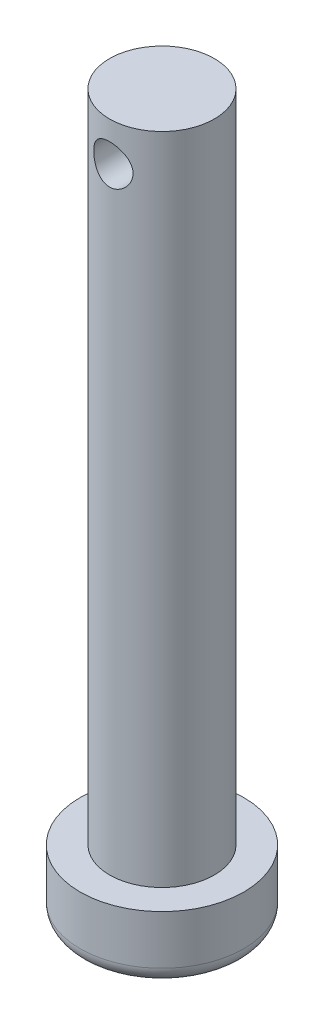
ISO-10303-21;
HEADER;
FILE_DESCRIPTION(('STEP AP214'),'2;1');
FILE_NAME('part.step','',(''),(''),'','','');
FILE_SCHEMA(('AUTOMOTIVE_DESIGN { 1 0 10303 214 1 1 1 1 }'));
ENDSEC;
DATA;
#1=APPLICATION_CONTEXT('core data for automotive mechanical design processes');
#2=APPLICATION_PROTOCOL_DEFINITION('international standard','automotive_design',2000,#1);
#3=PRODUCT_CONTEXT('',#1,'mechanical');
#4=PRODUCT('Part','Part','',(#3));
#5=PRODUCT_RELATED_PRODUCT_CATEGORY('part','',(#4));
#6=PRODUCT_DEFINITION_FORMATION('','',#4);
#7=PRODUCT_DEFINITION_CONTEXT('part definition',#1,'design');
#8=PRODUCT_DEFINITION('design','',#6,#7);
#9=PRODUCT_DEFINITION_SHAPE('','',#8);
#10=(LENGTH_UNIT() NAMED_UNIT(*) SI_UNIT(.MILLI.,.METRE.));
#11=(NAMED_UNIT(*) PLANE_ANGLE_UNIT() SI_UNIT($,.RADIAN.));
#12=(NAMED_UNIT(*) SI_UNIT($,.STERADIAN.) SOLID_ANGLE_UNIT());
#13=UNCERTAINTY_MEASURE_WITH_UNIT(LENGTH_MEASURE(1.E-05),#10,'distance_accuracy_value','');
#14=(GEOMETRIC_REPRESENTATION_CONTEXT(3) GLOBAL_UNCERTAINTY_ASSIGNED_CONTEXT((#13)) GLOBAL_UNIT_ASSIGNED_CONTEXT((#10,
#11,#12)) REPRESENTATION_CONTEXT('',''));
#15=CARTESIAN_POINT('',(0.,0.,0.));
#16=DIRECTION('',(0.,0.,1.));
#17=DIRECTION('',(1.,0.,0.));
#18=AXIS2_PLACEMENT_3D('',#15,#16,#17);
#19=CARTESIAN_POINT('',(0.,10.,0.));
#20=DIRECTION('',(0.,-1.,0.));
#21=DIRECTION('',(0.,0.,-1.));
#22=AXIS2_PLACEMENT_3D('',#19,#20,#21);
#23=CYLINDRICAL_SURFACE('',#22,12.5);
#24=CARTESIAN_POINT('',(0.,2.5,0.));
#25=DIRECTION('',(0.,1.,0.));
#26=DIRECTION('',(0.,0.,1.));
#27=AXIS2_PLACEMENT_3D('',#24,#25,#26);
#28=CIRCLE('',#27,12.5);
#29=CARTESIAN_POINT('',(0.,2.5,12.5));
#30=VERTEX_POINT('',#29);
#31=EDGE_CURVE('E43',#30,#30,#28,.T.);
#32=ORIENTED_EDGE('',*,*,#31,.T.);
#33=EDGE_LOOP('',(#32));
#34=FACE_BOUND('',#33,.T.);
#35=CARTESIAN_POINT('',(0.,10.,0.));
#36=DIRECTION('',(0.,1.,0.));
#37=DIRECTION('',(0.,0.,1.));
#38=AXIS2_PLACEMENT_3D('',#35,#36,#37);
#39=CIRCLE('',#38,12.5);
#40=CARTESIAN_POINT('',(0.,10.,12.5));
#41=VERTEX_POINT('',#40);
#42=EDGE_CURVE('E48',#41,#41,#39,.T.);
#43=ORIENTED_EDGE('',*,*,#42,.F.);
#44=EDGE_LOOP('',(#43));
#45=FACE_BOUND('',#44,.T.);
#46=ADVANCED_FACE('F31',(#34,#45),#23,.T.);
#47=CARTESIAN_POINT('',(0.,10.,0.));
#48=DIRECTION('',(0.,1.,0.));
#49=DIRECTION('',(0.,0.,1.));
#50=AXIS2_PLACEMENT_3D('',#47,#48,#49);
#51=PLANE('',#50);
#52=CARTESIAN_POINT('',(0.,10.,0.));
#53=DIRECTION('',(0.,1.,0.));
#54=DIRECTION('',(0.,0.,1.));
#55=AXIS2_PLACEMENT_3D('',#52,#53,#54);
#56=CIRCLE('',#55,8.);
#57=CARTESIAN_POINT('',(0.,10.,8.));
#58=VERTEX_POINT('',#57);
#59=EDGE_CURVE('E129',#58,#58,#56,.T.);
#60=ORIENTED_EDGE('',*,*,#59,.F.);
#61=EDGE_LOOP('',(#60));
#62=FACE_BOUND('',#61,.T.);
#63=ORIENTED_EDGE('',*,*,#42,.T.);
#64=EDGE_LOOP('',(#63));
#65=FACE_BOUND('',#64,.T.);
#66=ADVANCED_FACE('F73',(#62,#65),#51,.T.);
#67=CARTESIAN_POINT('',(0.,0.,0.));
#68=DIRECTION('',(0.,1.,0.));
#69=DIRECTION('',(0.,0.,1.));
#70=AXIS2_PLACEMENT_3D('',#67,#68,#69);
#71=PLANE('',#70);
#72=CARTESIAN_POINT('',(0.,0.,0.));
#73=DIRECTION('',(0.,1.,0.));
#74=DIRECTION('',(0.,0.,1.));
#75=AXIS2_PLACEMENT_3D('',#72,#73,#74);
#76=CIRCLE('',#75,10.);
#77=CARTESIAN_POINT('',(0.,0.,10.));
#78=VERTEX_POINT('',#77);
#79=EDGE_CURVE('E10',#78,#78,#76,.F.);
#80=ORIENTED_EDGE('',*,*,#79,.T.);
#81=EDGE_LOOP('',(#80));
#82=FACE_BOUND('',#81,.T.);
#83=ADVANCED_FACE('F78',(#82),#71,.F.);
#84=CARTESIAN_POINT('',(0.,2.5,0.));
#85=DIRECTION('',(0.,1.,0.));
#86=DIRECTION('',(0.,0.,1.));
#87=AXIS2_PLACEMENT_3D('',#84,#85,#86);
#88=TOROIDAL_SURFACE('',#87,10.,2.5);
#89=ORIENTED_EDGE('',*,*,#79,.F.);
#90=EDGE_LOOP('',(#89));
#91=FACE_BOUND('',#90,.T.);
#92=ORIENTED_EDGE('',*,*,#31,.F.);
#93=EDGE_LOOP('',(#92));
#94=FACE_BOUND('',#93,.T.);
#95=ADVANCED_FACE('F33',(#91,#94),#88,.T.);
#96=CARTESIAN_POINT('',(0.,110.,0.));
#97=DIRECTION('',(0.,-1.,0.));
#98=DIRECTION('',(0.,0.,-1.));
#99=AXIS2_PLACEMENT_3D('',#96,#97,#98);
#100=CYLINDRICAL_SURFACE('',#99,8.);
#101=CARTESIAN_POINT('',(0.,107.,-8.));
#102=CARTESIAN_POINT('',(-0.162470117875706,107.000005804606,-8.00000434912302));
#103=CARTESIAN_POINT('',(-0.324900483563586,106.986760479503,-7.99500758566368));
#104=CARTESIAN_POINT('',(-0.644906904704724,106.93434360946,-7.97557392013855));
#105=CARTESIAN_POINT('',(-0.802483655975232,106.895175799059,-7.96113837787987));
#106=CARTESIAN_POINT('',(-1.10812156998176,106.792493996456,-7.92437664783088));
#107=CARTESIAN_POINT('',(-1.25620044832456,106.729026966356,-7.90206568698877));
#108=CARTESIAN_POINT('',(-1.53959862032052,106.579787173968,-7.85177535530709));
#109=CARTESIAN_POINT('',(-1.67491447835577,106.494008428912,-7.82379446455107));
#110=CARTESIAN_POINT('',(-1.93469283409165,106.298774937858,-7.76372493942421));
#111=CARTESIAN_POINT('',(-2.05854146030238,106.188539475481,-7.73152005167087));
#112=CARTESIAN_POINT('',(-2.28648842948728,105.949179130682,-7.66720441742698));
#113=CARTESIAN_POINT('',(-2.39058072718412,105.820048487824,-7.63509370270232));
#114=CARTESIAN_POINT('',(-2.57996404431964,105.540565064953,-7.5732494123529));
#115=CARTESIAN_POINT('',(-2.66438786391496,105.389591266908,-7.5436529764098));
#116=CARTESIAN_POINT('',(-2.80637292668193,105.074303291663,-7.49199720475523));
#117=CARTESIAN_POINT('',(-2.86394489922567,104.909994473692,-7.46993485954215));
#118=CARTESIAN_POINT('',(-2.94816862035013,104.579766519482,-7.4370882564592));
#119=CARTESIAN_POINT('',(-2.97599186436803,104.414189923123,-7.42587848693063));
#120=CARTESIAN_POINT('',(-3.00359113063608,104.080367684018,-7.41476122931038));
#121=CARTESIAN_POINT('',(-3.00337873606425,103.912123172274,-7.41484907350686));
#122=CARTESIAN_POINT('',(-2.97580859218857,103.588460949543,-7.42595023233986));
#123=CARTESIAN_POINT('',(-2.95007617013711,103.432878187815,-7.43630937632964));
#124=CARTESIAN_POINT('',(-2.87488335732475,103.128425699098,-7.46569876010067));
#125=CARTESIAN_POINT('',(-2.82541939325577,102.979556986751,-7.48473030568195));
#126=CARTESIAN_POINT('',(-2.70327497145115,102.689445864573,-7.52971404410467));
#127=CARTESIAN_POINT('',(-2.63017297474553,102.548401027765,-7.55579035984378));
#128=CARTESIAN_POINT('',(-2.46312147525045,102.28010852481,-7.61188420270589));
#129=CARTESIAN_POINT('',(-2.36916477457696,102.152865644958,-7.64190308912093));
#130=CARTESIAN_POINT('',(-2.15563561533201,101.906792672701,-7.70496077720597));
#131=CARTESIAN_POINT('',(-2.03476597433938,101.789102718504,-7.73806694911977));
#132=CARTESIAN_POINT('',(-1.77462518163776,101.575324067588,-7.80183456327535));
#133=CARTESIAN_POINT('',(-1.63535120699464,101.479238690788,-7.83249562931733));
#134=CARTESIAN_POINT('',(-1.33944687398491,101.310139205875,-7.88852789618334));
#135=CARTESIAN_POINT('',(-1.18258142768945,101.237504837558,-7.91380996519279));
#136=CARTESIAN_POINT('',(-0.857673701049139,101.12003479146,-7.95557436653878));
#137=CARTESIAN_POINT('',(-0.689636421691524,101.075186766878,-7.97206060682974));
#138=CARTESIAN_POINT('',(-0.356750486297331,101.016754424916,-7.99368886456142));
#139=CARTESIAN_POINT('',(-0.192207239124416,101.001634787235,-7.99938738051376));
#140=CARTESIAN_POINT('',(0.137144950510054,100.9986178722,-8.00051787400248));
#141=CARTESIAN_POINT('',(0.301953825966749,101.010714559366,-7.99595212773725));
#142=CARTESIAN_POINT('',(0.62052409712372,101.060620084617,-7.97743419545287));
#143=CARTESIAN_POINT('',(0.774466656014674,101.097423087474,-7.9638494192461));
#144=CARTESIAN_POINT('',(1.07388350991444,101.194372145095,-7.92902954183434));
#145=CARTESIAN_POINT('',(1.21935670069507,101.254521235896,-7.9077934456406));
#146=CARTESIAN_POINT('',(1.50249553022031,101.398372824879,-7.85899248815363));
#147=CARTESIAN_POINT('',(1.63980616711559,101.482715458447,-7.83126000418697));
#148=CARTESIAN_POINT('',(1.89878542345325,101.671836206343,-7.77253343129328));
#149=CARTESIAN_POINT('',(2.0204482405409,101.77662186509,-7.74153814019032));
#150=CARTESIAN_POINT('',(2.25206159748909,102.010808244249,-7.67746658981979));
#151=CARTESIAN_POINT('',(2.36092308247138,102.141284365545,-7.64437393007458));
#152=CARTESIAN_POINT('',(2.55542100063807,102.419302769415,-7.58157631493707));
#153=CARTESIAN_POINT('',(2.64105534829037,102.566846582777,-7.55187166388798));
#154=CARTESIAN_POINT('',(2.78675547037996,102.876031973545,-7.49933659644926));
#155=CARTESIAN_POINT('',(2.84671370893837,103.037729491821,-7.47653520656986));
#156=CARTESIAN_POINT('',(2.93815766933779,103.370019527376,-7.4410806578201));
#157=CARTESIAN_POINT('',(2.9696610061107,103.540606472396,-7.42842122114981));
#158=CARTESIAN_POINT('',(3.00172694195678,103.874032319082,-7.41551789585147));
#159=CARTESIAN_POINT('',(3.00414662991675,104.036665263434,-7.41452889046682));
#160=CARTESIAN_POINT('',(2.98273431283185,104.359890632552,-7.42316825490584));
#161=CARTESIAN_POINT('',(2.95890479700247,104.520483249343,-7.43279561797798));
#162=CARTESIAN_POINT('',(2.88711631260483,104.830094453433,-7.46096283170865));
#163=CARTESIAN_POINT('',(2.83991596633048,104.979316692491,-7.47922170753326));
#164=CARTESIAN_POINT('',(2.72339393559839,105.267811016989,-7.5224309659569));
#165=CARTESIAN_POINT('',(2.65406665889888,105.40708057614,-7.54738303990429));
#166=CARTESIAN_POINT('',(2.49104151876307,105.679653579395,-7.60279447807929));
#167=CARTESIAN_POINT('',(2.3962566560602,105.8122615936,-7.63347396881928));
#168=CARTESIAN_POINT('',(2.18668971459811,106.060283121942,-7.69612493514355));
#169=CARTESIAN_POINT('',(2.07190128025616,106.175691149574,-7.7280968188629));
#170=CARTESIAN_POINT('',(1.81816079356924,106.392403911644,-7.79180849219762));
#171=CARTESIAN_POINT('',(1.67823728842598,106.492607506869,-7.82344209801289));
#172=CARTESIAN_POINT('',(1.38242644640163,106.668045310553,-7.88109028914061));
#173=CARTESIAN_POINT('',(1.22653786818124,106.743277575473,-7.90710443703119));
#174=CARTESIAN_POINT('',(0.895998164004618,106.868753658097,-7.9514858521336));
#175=CARTESIAN_POINT('',(0.720826844468411,106.917774129204,-7.96947314316712));
#176=CARTESIAN_POINT('',(0.363751467212761,106.983385919841,-7.99372484359173));
#177=CARTESIAN_POINT('',(0.181850832729717,106.999993502975,-7.99999513207934));
#178=CARTESIAN_POINT('',(0.,107.,-8.));
#179=B_SPLINE_CURVE_WITH_KNOTS('',3,(#101,#102,#103,#104,#105,#106,#107,#108,#109,#110,#111,
#112,#113,#114,#115,#116,#117,#118,#119,#120,#121,#122,#123,#124,#125,#126,#127,#128,#129,#130,
#131,#132,#133,#134,#135,#136,#137,#138,#139,#140,#141,#142,#143,#144,#145,#146,#147,#148,#149,
#150,#151,#152,#153,#154,#155,#156,#157,#158,#159,#160,#161,#162,#163,#164,#165,#166,#167,#168,
#169,#170,#171,#172,#173,#174,#175,#176,#177,#178),.UNSPECIFIED.,.T.,.F.,(4,2,2,2,2,2,2,2,2,2,2,
2,2,2,2,2,2,2,2,2,2,2,2,2,2,2,2,2,2,2,2,2,2,2,2,2,2,2,4),(0.,0.486739603121121,
0.973409099060925,1.45914273842716,1.94500675921898,2.44947237165432,2.95409209851244,
3.47793349003317,4.00156538704267,4.50371748833803,5.00566212159415,5.47756690242936,
5.94954276126852,6.43044816779711,6.91151981494191,7.424923066773,7.93840515815807,
8.45982750577826,8.98101799403366,9.47450039277526,9.96787336786716,10.4422887585335,
10.9167658651458,11.4051844372487,11.8937836004541,12.4107303891699,12.9277235784596,
13.4468613346008,13.9656774991869,14.4511752696618,14.9366270042819,15.4072628485874,
15.8780177331869,16.3734494377422,16.869038839998,17.3914465931375,17.9138949961588,
18.4589703006976,19.0037720359793),.UNSPECIFIED.);
#180=CARTESIAN_POINT('',(0.,107.,-8.));
#181=VERTEX_POINT('',#180);
#182=EDGE_CURVE('E35',#181,#181,#179,.T.);
#183=ORIENTED_EDGE('',*,*,#182,.T.);
#184=EDGE_LOOP('',(#183));
#185=FACE_BOUND('',#184,.T.);
#186=CARTESIAN_POINT('',(3.,104.,7.41619848709566));
#187=CARTESIAN_POINT('',(3.00000608211288,103.837985032517,7.41619281215226));
#188=CARTESIAN_POINT('',(2.98683195095364,103.676010154874,7.42156520296313));
#189=CARTESIAN_POINT('',(2.93472375787483,103.356943834065,7.44232318425766));
#190=CARTESIAN_POINT('',(2.89579046745932,103.199852244788,7.45770847484803));
#191=CARTESIAN_POINT('',(2.79379315222297,102.895249256811,7.49650960610892));
#192=CARTESIAN_POINT('',(2.73078694533005,102.747715886708,7.51990619151696));
#193=CARTESIAN_POINT('',(2.58263713485086,102.465256206352,7.57206268400018));
#194=CARTESIAN_POINT('',(2.49748688189992,102.330333699432,7.60082420131042));
#195=CARTESIAN_POINT('',(2.30293322748412,102.070219376757,7.66207149335192));
#196=CARTESIAN_POINT('',(2.19260762426637,101.945742940742,7.69466683848217));
#197=CARTESIAN_POINT('',(1.95279167955762,101.716554370656,7.75899501256083));
#198=CARTESIAN_POINT('',(1.8232972605133,101.611846452516,7.79072765629295));
#199=CARTESIAN_POINT('',(1.54338931035527,101.421720975409,7.8510574787339));
#200=CARTESIAN_POINT('',(1.39241389507608,101.337081050568,7.87951122447087));
#201=CARTESIAN_POINT('',(1.07711154393048,101.19469765495,7.92876015947619));
#202=CARTESIAN_POINT('',(0.912789261867065,101.136944856016,7.94955800433994));
#203=CARTESIAN_POINT('',(0.582978683353667,101.052484208451,7.98037394206897));
#204=CARTESIAN_POINT('',(0.417846394563195,101.024544745119,7.99081830429549));
#205=CARTESIAN_POINT('',(0.0849287275895651,100.99655759811,8.0012802821588));
#206=CARTESIAN_POINT('',(-0.0828557701256811,100.996500844763,8.0013012882982));
#207=CARTESIAN_POINT('',(-0.407487086128939,101.02356352293,7.99118531807773));
#208=CARTESIAN_POINT('',(-0.564464356533753,101.049338595898,7.98155083993306));
#209=CARTESIAN_POINT('',(-0.871678435968826,101.125071830451,7.95386549864585));
#210=CARTESIAN_POINT('',(-1.02191476686077,101.175031704524,7.93581403951378));
#211=CARTESIAN_POINT('',(-1.31397803460604,101.298340903351,7.89275538334835));
#212=CARTESIAN_POINT('',(-1.45565078457397,101.372020010536,7.86765078939303));
#213=CARTESIAN_POINT('',(-1.72497321591576,101.54038419386,7.81302620451409));
#214=CARTESIAN_POINT('',(-1.85261835386705,101.635076046039,7.78350479028858));
#215=CARTESIAN_POINT('',(-2.09818097359933,101.849254572562,7.72105059308269));
#216=CARTESIAN_POINT('',(-2.2150922905172,101.969867831285,7.68801927514871));
#217=CARTESIAN_POINT('',(-2.42740791139661,102.229185986659,7.62364921304341));
#218=CARTESIAN_POINT('',(-2.52280681389449,102.367895413231,7.59231089545926));
#219=CARTESIAN_POINT('',(-2.69131223613209,102.663438934877,7.53425406951149));
#220=CARTESIAN_POINT('',(-2.76387695690677,102.820606987171,7.50765354114235));
#221=CARTESIAN_POINT('',(-2.88112928869848,103.146192450128,7.4634487707231));
#222=CARTESIAN_POINT('',(-2.925832412077,103.314603543126,7.44583952363152));
#223=CARTESIAN_POINT('',(-2.98380383422379,103.647951924675,7.4227919449154));
#224=CARTESIAN_POINT('',(-2.99867042318746,103.812568211084,7.41673570495336));
#225=CARTESIAN_POINT('',(-3.00115771271731,104.142018713472,7.41573079037772));
#226=CARTESIAN_POINT('',(-2.9887852218731,104.306852864702,7.42077934004762));
#227=CARTESIAN_POINT('',(-2.93859467040517,104.623859844578,7.44078763262529));
#228=CARTESIAN_POINT('',(-2.90201236668503,104.77626227153,7.45526552433718));
#229=CARTESIAN_POINT('',(-2.80599549281221,105.07269588944,7.49192974091902));
#230=CARTESIAN_POINT('',(-2.74655624069231,105.216725358336,7.51411764500122));
#231=CARTESIAN_POINT('',(-2.60400584550571,105.498328876153,7.56472486232391));
#232=CARTESIAN_POINT('',(-2.52009090354097,105.635458584275,7.59334657784192));
#233=CARTESIAN_POINT('',(-2.33182635724954,105.894257963452,7.6532562858852));
#234=CARTESIAN_POINT('',(-2.22746927392868,106.015921949249,7.68454525188137));
#235=CARTESIAN_POINT('',(-1.99345468180189,106.24833674639,7.74866093106387));
#236=CARTESIAN_POINT('',(-1.86261268298213,106.357906817537,7.7814593871406));
#237=CARTESIAN_POINT('',(-1.5835949435063,106.553676735179,7.84299749926599));
#238=CARTESIAN_POINT('',(-1.43541914664535,106.639876505892,7.87173714215327));
#239=CARTESIAN_POINT('',(-1.12603265893696,106.785892112399,7.92189971409105));
#240=CARTESIAN_POINT('',(-0.964868866129254,106.845798247585,7.9433476267602));
#241=CARTESIAN_POINT('',(-0.633763775046506,106.9373128277,7.97658873425142));
#242=CARTESIAN_POINT('',(-0.463826641447182,106.968934570845,7.98838646598825));
#243=CARTESIAN_POINT('',(-0.130671170547626,107.00154880551,8.00056814634147));
#244=CARTESIAN_POINT('',(0.032361536121695,107.004218966118,8.00157721907528));
#245=CARTESIAN_POINT('',(0.35645357282485,106.983169681109,7.99369779618447));
#246=CARTESIAN_POINT('',(0.517513138490515,106.959453418228,7.98481049426262));
#247=CARTESIAN_POINT('',(0.829096496754257,106.887482297013,7.95842179207541));
#248=CARTESIAN_POINT('',(0.979781462137679,106.839840188243,7.9411358275603));
#249=CARTESIAN_POINT('',(1.27103094601279,106.721979973231,7.89975567241984));
#250=CARTESIAN_POINT('',(1.41159354255109,106.65175759339,7.87566019311345));
#251=CARTESIAN_POINT('',(1.68508035398882,106.48737211299,7.8218123660013));
#252=CARTESIAN_POINT('',(1.81743509769368,106.392326718972,7.79186480217587));
#253=CARTESIAN_POINT('',(2.06483469504673,106.182384339625,7.72999015389759));
#254=CARTESIAN_POINT('',(2.17987334251184,106.067480268384,7.69806236548317));
#255=CARTESIAN_POINT('',(2.39562428472386,105.81387173671,7.63376259478074));
#256=CARTESIAN_POINT('',(2.49525999632032,105.674231195691,7.60145610697262));
#257=CARTESIAN_POINT('',(2.66969419113706,105.379168260854,7.54196650008334));
#258=CARTESIAN_POINT('',(2.74449009756384,105.223744231895,7.51478391266386));
#259=CARTESIAN_POINT('',(2.86931773948448,104.894088638047,7.46804539702406));
#260=CARTESIAN_POINT('',(2.91812005798767,104.71933126697,7.44887606566003));
#261=CARTESIAN_POINT('',(2.98344713444438,104.363029456095,7.42295988688337));
#262=CARTESIAN_POINT('',(2.99999318680184,104.181489574606,7.41620484418155));
#263=CARTESIAN_POINT('',(3.,104.,7.41619848709566));
#264=B_SPLINE_CURVE_WITH_KNOTS('',3,(#186,#187,#188,#189,#190,#191,#192,#193,#194,#195,#196,
#197,#198,#199,#200,#201,#202,#203,#204,#205,#206,#207,#208,#209,#210,#211,#212,#213,#214,#215,
#216,#217,#218,#219,#220,#221,#222,#223,#224,#225,#226,#227,#228,#229,#230,#231,#232,#233,#234,
#235,#236,#237,#238,#239,#240,#241,#242,#243,#244,#245,#246,#247,#248,#249,#250,#251,#252,#253,
#254,#255,#256,#257,#258,#259,#260,#261,#262,#263),.UNSPECIFIED.,.T.,.F.,(4,2,2,2,2,2,2,2,2,2,2,
2,2,2,2,2,2,2,2,2,2,2,2,2,2,2,2,2,2,2,2,2,2,2,2,2,2,2,4),(0.,0.485369082889289,
0.970723629307669,1.45491971362404,1.93926135947583,2.44549304813251,2.95183257656961,
3.47540144283838,3.99878852773656,4.49960036990355,5.00024930820711,5.47612945617385,
5.95204330537667,6.43488262432332,6.91787787268947,7.42913350142744,7.94051735665666,
8.46325184520834,8.9856950329059,9.47931315500612,9.9728079079741,10.4428769187604,
10.9130422687869,11.4008312203129,11.8887989695235,12.4077003400689,12.9266033932,
13.4437101779998,13.960573711399,14.4473144111951,14.933996406586,15.4088054802742,
15.883704470453,16.3785664737361,16.8736054180957,17.394771991038,17.9159926110813,
18.460063577615,19.0037752466575),.UNSPECIFIED.);
#265=CARTESIAN_POINT('',(3.,104.,7.41619848709566));
#266=VERTEX_POINT('',#265);
#267=EDGE_CURVE('E51',#266,#266,#264,.T.);
#268=ORIENTED_EDGE('',*,*,#267,.T.);
#269=EDGE_LOOP('',(#268));
#270=FACE_BOUND('',#269,.T.);
#271=CARTESIAN_POINT('',(0.,110.,0.));
#272=DIRECTION('',(0.,1.,0.));
#273=DIRECTION('',(0.,0.,1.));
#274=AXIS2_PLACEMENT_3D('',#271,#272,#273);
#275=CIRCLE('',#274,8.);
#276=CARTESIAN_POINT('',(0.,110.,8.));
#277=VERTEX_POINT('',#276);
#278=EDGE_CURVE('E128',#277,#277,#275,.T.);
#279=ORIENTED_EDGE('',*,*,#278,.F.);
#280=EDGE_LOOP('',(#279));
#281=FACE_BOUND('',#280,.T.);
#282=ORIENTED_EDGE('',*,*,#59,.T.);
#283=EDGE_LOOP('',(#282));
#284=FACE_BOUND('',#283,.T.);
#285=ADVANCED_FACE('F55',(#185,#270,#281,#284),#100,.T.);
#286=CARTESIAN_POINT('',(0.,110.,0.));
#287=DIRECTION('',(0.,1.,0.));
#288=DIRECTION('',(0.,0.,1.));
#289=AXIS2_PLACEMENT_3D('',#286,#287,#288);
#290=PLANE('',#289);
#291=ORIENTED_EDGE('',*,*,#278,.T.);
#292=EDGE_LOOP('',(#291));
#293=FACE_BOUND('',#292,.T.);
#294=ADVANCED_FACE('F62',(#293),#290,.T.);
#295=CARTESIAN_POINT('',(0.,104.,-50.));
#296=DIRECTION('',(0.,0.,1.));
#297=DIRECTION('',(1.,0.,0.));
#298=AXIS2_PLACEMENT_3D('',#295,#296,#297);
#299=CYLINDRICAL_SURFACE('',#298,3.);
#300=ORIENTED_EDGE('',*,*,#267,.F.);
#301=EDGE_LOOP('',(#300));
#302=FACE_BOUND('',#301,.T.);
#303=ORIENTED_EDGE('',*,*,#182,.F.);
#304=EDGE_LOOP('',(#303));
#305=FACE_BOUND('',#304,.T.);
#306=ADVANCED_FACE('F59',(#302,#305),#299,.F.);
#307=CLOSED_SHELL('',(#46,#66,#83,#95,#285,#294,#306));
#308=MANIFOLD_SOLID_BREP('B2',#307);
#309=ADVANCED_BREP_SHAPE_REPRESENTATION('',(#18,#308),#14);
#310=SHAPE_DEFINITION_REPRESENTATION(#9,#309);
ENDSEC;
END-ISO-10303-21;
